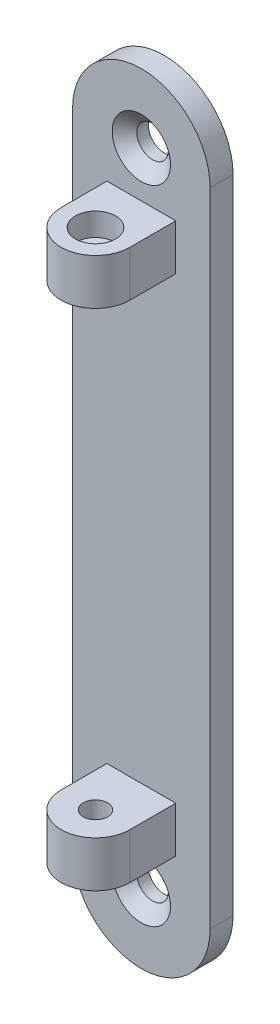
ISO-10303-21;
HEADER;
FILE_DESCRIPTION(('STEP AP214'),'2;1');
FILE_NAME('part.step','',(''),(''),'','','');
FILE_SCHEMA(('AUTOMOTIVE_DESIGN { 1 0 10303 214 1 1 1 1 }'));
ENDSEC;
DATA;
#1=APPLICATION_CONTEXT('core data for automotive mechanical design processes');
#2=APPLICATION_PROTOCOL_DEFINITION('international standard','automotive_design',2000,#1);
#3=PRODUCT_CONTEXT('',#1,'mechanical');
#4=PRODUCT('Part','Part','',(#3));
#5=PRODUCT_RELATED_PRODUCT_CATEGORY('part','',(#4));
#6=PRODUCT_DEFINITION_FORMATION('','',#4);
#7=PRODUCT_DEFINITION_CONTEXT('part definition',#1,'design');
#8=PRODUCT_DEFINITION('design','',#6,#7);
#9=PRODUCT_DEFINITION_SHAPE('','',#8);
#10=(LENGTH_UNIT() NAMED_UNIT(*) SI_UNIT(.MILLI.,.METRE.));
#11=(NAMED_UNIT(*) PLANE_ANGLE_UNIT() SI_UNIT($,.RADIAN.));
#12=(NAMED_UNIT(*) SI_UNIT($,.STERADIAN.) SOLID_ANGLE_UNIT());
#13=UNCERTAINTY_MEASURE_WITH_UNIT(LENGTH_MEASURE(1.E-05),#10,'distance_accuracy_value','');
#14=(GEOMETRIC_REPRESENTATION_CONTEXT(3) GLOBAL_UNCERTAINTY_ASSIGNED_CONTEXT((#13)) GLOBAL_UNIT_ASSIGNED_CONTEXT((#10,
#11,#12)) REPRESENTATION_CONTEXT('',''));
#15=CARTESIAN_POINT('',(0.,0.,0.));
#16=DIRECTION('',(0.,0.,1.));
#17=DIRECTION('',(1.,0.,0.));
#18=AXIS2_PLACEMENT_3D('',#15,#16,#17);
#19=CARTESIAN_POINT('',(19.05,88.9,6.35));
#20=DIRECTION('',(0.,0.,-1.));
#21=DIRECTION('',(-1.,0.,0.));
#22=AXIS2_PLACEMENT_3D('',#19,#20,#21);
#23=PLANE('',#22);
#24=DIRECTION('',(0.,-1.,0.));
#25=VECTOR('',#24,1.);
#26=CARTESIAN_POINT('',(0.,0.,6.35));
#27=LINE('',#26,#25);
#28=CARTESIAN_POINT('',(0.,88.9,6.35));
#29=VERTEX_POINT('',#28);
#30=CARTESIAN_POINT('',(0.,-88.9,6.35));
#31=VERTEX_POINT('',#30);
#32=EDGE_CURVE('E275',#29,#31,#27,.T.);
#33=ORIENTED_EDGE('',*,*,#32,.T.);
#34=CARTESIAN_POINT('',(19.05,-88.9,6.35));
#35=DIRECTION('',(0.,0.,-1.));
#36=DIRECTION('',(-1.,0.,0.));
#37=AXIS2_PLACEMENT_3D('',#34,#35,#36);
#38=CIRCLE('',#37,19.05);
#39=CARTESIAN_POINT('',(38.1,-88.9,6.35));
#40=VERTEX_POINT('',#39);
#41=EDGE_CURVE('E181',#40,#31,#38,.T.);
#42=ORIENTED_EDGE('',*,*,#41,.F.);
#43=DIRECTION('',(0.,1.,0.));
#44=VECTOR('',#43,1.);
#45=CARTESIAN_POINT('',(38.1,88.9,6.35));
#46=LINE('',#45,#44);
#47=CARTESIAN_POINT('',(38.1,88.9,6.35));
#48=VERTEX_POINT('',#47);
#49=EDGE_CURVE('E268',#40,#48,#46,.T.);
#50=ORIENTED_EDGE('',*,*,#49,.T.);
#51=CARTESIAN_POINT('',(19.05,88.9,6.35));
#52=DIRECTION('',(0.,0.,1.));
#53=DIRECTION('',(-1.,0.,0.));
#54=AXIS2_PLACEMENT_3D('',#51,#52,#53);
#55=CIRCLE('',#54,19.05);
#56=EDGE_CURVE('E271',#48,#29,#55,.T.);
#57=ORIENTED_EDGE('',*,*,#56,.T.);
#58=EDGE_LOOP('',(#33,#42,#50,#57));
#59=FACE_BOUND('',#58,.T.);
#60=CARTESIAN_POINT('',(19.05,88.9,6.35));
#61=DIRECTION('',(0.,0.,1.));
#62=DIRECTION('',(1.,0.,0.));
#63=AXIS2_PLACEMENT_3D('',#60,#61,#62);
#64=CIRCLE('',#63,8.0645);
#65=CARTESIAN_POINT('',(27.1145,88.9,6.35));
#66=VERTEX_POINT('',#65);
#67=EDGE_CURVE('E255',#66,#66,#64,.T.);
#68=ORIENTED_EDGE('',*,*,#67,.F.);
#69=EDGE_LOOP('',(#68));
#70=FACE_BOUND('',#69,.T.);
#71=DIRECTION('',(0.,1.,0.));
#72=VECTOR('',#71,1.);
#73=CARTESIAN_POINT('',(28.575,63.5,6.35));
#74=LINE('',#73,#72);
#75=CARTESIAN_POINT('',(28.575,63.5,6.35));
#76=VERTEX_POINT('',#75);
#77=CARTESIAN_POINT('',(28.575,76.2,6.35));
#78=VERTEX_POINT('',#77);
#79=EDGE_CURVE('E217',#76,#78,#74,.T.);
#80=ORIENTED_EDGE('',*,*,#79,.F.);
#81=DIRECTION('',(1.,0.,0.));
#82=VECTOR('',#81,1.);
#83=CARTESIAN_POINT('',(9.525,63.5,6.35));
#84=LINE('',#83,#82);
#85=CARTESIAN_POINT('',(9.525,63.5,6.35));
#86=VERTEX_POINT('',#85);
#87=EDGE_CURVE('E226',#86,#76,#84,.T.);
#88=ORIENTED_EDGE('',*,*,#87,.F.);
#89=DIRECTION('',(0.,-1.,0.));
#90=VECTOR('',#89,1.);
#91=CARTESIAN_POINT('',(9.525,63.5,6.35));
#92=LINE('',#91,#90);
#93=CARTESIAN_POINT('',(9.525,76.2,6.35));
#94=VERTEX_POINT('',#93);
#95=EDGE_CURVE('E60',#94,#86,#92,.T.);
#96=ORIENTED_EDGE('',*,*,#95,.F.);
#97=DIRECTION('',(-1.,0.,0.));
#98=VECTOR('',#97,1.);
#99=CARTESIAN_POINT('',(9.525,76.2,6.35));
#100=LINE('',#99,#98);
#101=EDGE_CURVE('E55',#78,#94,#100,.T.);
#102=ORIENTED_EDGE('',*,*,#101,.F.);
#103=EDGE_LOOP('',(#80,#88,#96,#102));
#104=FACE_BOUND('',#103,.T.);
#105=CARTESIAN_POINT('',(19.05,-88.9,6.35));
#106=DIRECTION('',(0.,0.,-1.));
#107=DIRECTION('',(1.,0.,0.));
#108=AXIS2_PLACEMENT_3D('',#105,#106,#107);
#109=CIRCLE('',#108,8.0645);
#110=CARTESIAN_POINT('',(27.1145,-88.9,6.35));
#111=VERTEX_POINT('',#110);
#112=EDGE_CURVE('E168',#111,#111,#109,.T.);
#113=ORIENTED_EDGE('',*,*,#112,.T.);
#114=EDGE_LOOP('',(#113));
#115=FACE_BOUND('',#114,.T.);
#116=DIRECTION('',(0.,-1.,0.));
#117=VECTOR('',#116,1.);
#118=CARTESIAN_POINT('',(28.575,-63.5,6.35));
#119=LINE('',#118,#117);
#120=CARTESIAN_POINT('',(28.575,-63.5,6.35));
#121=VERTEX_POINT('',#120);
#122=CARTESIAN_POINT('',(28.575,-76.2,6.35));
#123=VERTEX_POINT('',#122);
#124=EDGE_CURVE('E137',#121,#123,#119,.T.);
#125=ORIENTED_EDGE('',*,*,#124,.T.);
#126=DIRECTION('',(-1.,0.,0.));
#127=VECTOR('',#126,1.);
#128=CARTESIAN_POINT('',(9.52499999999999,-76.2,6.35));
#129=LINE('',#128,#127);
#130=CARTESIAN_POINT('',(9.52499999999999,-76.2,6.35));
#131=VERTEX_POINT('',#130);
#132=EDGE_CURVE('E343',#123,#131,#129,.T.);
#133=ORIENTED_EDGE('',*,*,#132,.T.);
#134=DIRECTION('',(0.,1.,0.));
#135=VECTOR('',#134,1.);
#136=CARTESIAN_POINT('',(9.52499999999999,-63.5,6.35));
#137=LINE('',#136,#135);
#138=CARTESIAN_POINT('',(9.52499999999999,-63.5,6.35));
#139=VERTEX_POINT('',#138);
#140=EDGE_CURVE('E347',#131,#139,#137,.T.);
#141=ORIENTED_EDGE('',*,*,#140,.T.);
#142=DIRECTION('',(1.,0.,0.));
#143=VECTOR('',#142,1.);
#144=CARTESIAN_POINT('',(9.52499999999999,-63.5,6.35));
#145=LINE('',#144,#143);
#146=EDGE_CURVE('E148',#139,#121,#145,.T.);
#147=ORIENTED_EDGE('',*,*,#146,.T.);
#148=EDGE_LOOP('',(#125,#133,#141,#147));
#149=FACE_BOUND('',#148,.T.);
#150=ADVANCED_FACE('F39',(#59,#70,#104,#115,#149),#23,.F.);
#151=CARTESIAN_POINT('',(38.1,88.9,6.35));
#152=DIRECTION('',(-1.,0.,0.));
#153=DIRECTION('',(0.,-1.,0.));
#154=AXIS2_PLACEMENT_3D('',#151,#152,#153);
#155=PLANE('',#154);
#156=DIRECTION('',(0.,1.,0.));
#157=VECTOR('',#156,1.);
#158=CARTESIAN_POINT('',(38.1,88.9,0.));
#159=LINE('',#158,#157);
#160=CARTESIAN_POINT('',(38.1,-88.9,0.));
#161=VERTEX_POINT('',#160);
#162=CARTESIAN_POINT('',(38.1,88.9,0.));
#163=VERTEX_POINT('',#162);
#164=EDGE_CURVE('E267',#161,#163,#159,.T.);
#165=ORIENTED_EDGE('',*,*,#164,.T.);
#166=DIRECTION('',(0.,0.,-1.));
#167=VECTOR('',#166,1.);
#168=CARTESIAN_POINT('',(38.1,88.9,6.35));
#169=LINE('',#168,#167);
#170=EDGE_CURVE('E11',#48,#163,#169,.T.);
#171=ORIENTED_EDGE('',*,*,#170,.F.);
#172=ORIENTED_EDGE('',*,*,#49,.F.);
#173=DIRECTION('',(0.,0.,-1.));
#174=VECTOR('',#173,1.);
#175=CARTESIAN_POINT('',(38.1,-88.9,6.35));
#176=LINE('',#175,#174);
#177=EDGE_CURVE('E192',#40,#161,#176,.T.);
#178=ORIENTED_EDGE('',*,*,#177,.T.);
#179=EDGE_LOOP('',(#165,#171,#172,#178));
#180=FACE_BOUND('',#179,.T.);
#181=ADVANCED_FACE('F41',(#180),#155,.F.);
#182=CARTESIAN_POINT('',(19.05,88.9,6.35));
#183=DIRECTION('',(0.,0.,-1.));
#184=DIRECTION('',(-1.,0.,0.));
#185=AXIS2_PLACEMENT_3D('',#182,#183,#184);
#186=CYLINDRICAL_SURFACE('',#185,19.05);
#187=CARTESIAN_POINT('',(19.05,88.9,0.));
#188=DIRECTION('',(0.,0.,1.));
#189=DIRECTION('',(-1.,0.,0.));
#190=AXIS2_PLACEMENT_3D('',#187,#188,#189);
#191=CIRCLE('',#190,19.05);
#192=CARTESIAN_POINT('',(0.,88.9,0.));
#193=VERTEX_POINT('',#192);
#194=EDGE_CURVE('E280',#163,#193,#191,.T.);
#195=ORIENTED_EDGE('',*,*,#194,.T.);
#196=DIRECTION('',(0.,0.,-1.));
#197=VECTOR('',#196,1.);
#198=CARTESIAN_POINT('',(0.,88.9,6.35));
#199=LINE('',#198,#197);
#200=EDGE_CURVE('E48',#29,#193,#199,.T.);
#201=ORIENTED_EDGE('',*,*,#200,.F.);
#202=ORIENTED_EDGE('',*,*,#56,.F.);
#203=ORIENTED_EDGE('',*,*,#170,.T.);
#204=EDGE_LOOP('',(#195,#201,#202,#203));
#205=FACE_BOUND('',#204,.T.);
#206=ADVANCED_FACE('F307',(#205),#186,.T.);
#207=CARTESIAN_POINT('',(0.,0.,6.35));
#208=DIRECTION('',(1.,0.,0.));
#209=DIRECTION('',(0.,0.,-1.));
#210=AXIS2_PLACEMENT_3D('',#207,#208,#209);
#211=PLANE('',#210);
#212=DIRECTION('',(0.,-1.,0.));
#213=VECTOR('',#212,1.);
#214=CARTESIAN_POINT('',(0.,0.,0.));
#215=LINE('',#214,#213);
#216=CARTESIAN_POINT('',(0.,-88.9,0.));
#217=VERTEX_POINT('',#216);
#218=EDGE_CURVE('E272',#193,#217,#215,.T.);
#219=ORIENTED_EDGE('',*,*,#218,.T.);
#220=DIRECTION('',(0.,0.,-1.));
#221=VECTOR('',#220,1.);
#222=CARTESIAN_POINT('',(0.,-88.9,6.35));
#223=LINE('',#222,#221);
#224=EDGE_CURVE('E185',#31,#217,#223,.T.);
#225=ORIENTED_EDGE('',*,*,#224,.F.);
#226=ORIENTED_EDGE('',*,*,#32,.F.);
#227=ORIENTED_EDGE('',*,*,#200,.T.);
#228=EDGE_LOOP('',(#219,#225,#226,#227));
#229=FACE_BOUND('',#228,.T.);
#230=ADVANCED_FACE('F290',(#229),#211,.F.);
#231=CARTESIAN_POINT('',(19.05,88.9,0.));
#232=DIRECTION('',(0.,0.,-1.));
#233=DIRECTION('',(-1.,0.,0.));
#234=AXIS2_PLACEMENT_3D('',#231,#232,#233);
#235=PLANE('',#234);
#236=CARTESIAN_POINT('',(19.05,88.9,0.));
#237=DIRECTION('',(0.,0.,1.));
#238=DIRECTION('',(1.,0.,0.));
#239=AXIS2_PLACEMENT_3D('',#236,#237,#238);
#240=CIRCLE('',#239,4.36499);
#241=CARTESIAN_POINT('',(23.41499,88.9,0.));
#242=VERTEX_POINT('',#241);
#243=EDGE_CURVE('E263',#242,#242,#240,.T.);
#244=ORIENTED_EDGE('',*,*,#243,.T.);
#245=EDGE_LOOP('',(#244));
#246=FACE_BOUND('',#245,.T.);
#247=ORIENTED_EDGE('',*,*,#164,.F.);
#248=CARTESIAN_POINT('',(19.05,-88.9,0.));
#249=DIRECTION('',(0.,0.,-1.));
#250=DIRECTION('',(-1.,0.,0.));
#251=AXIS2_PLACEMENT_3D('',#248,#249,#250);
#252=CIRCLE('',#251,19.05);
#253=EDGE_CURVE('E180',#161,#217,#252,.T.);
#254=ORIENTED_EDGE('',*,*,#253,.T.);
#255=ORIENTED_EDGE('',*,*,#218,.F.);
#256=ORIENTED_EDGE('',*,*,#194,.F.);
#257=EDGE_LOOP('',(#247,#254,#255,#256));
#258=FACE_BOUND('',#257,.T.);
#259=CARTESIAN_POINT('',(19.05,-88.9,0.));
#260=DIRECTION('',(0.,0.,-1.));
#261=DIRECTION('',(1.,0.,0.));
#262=AXIS2_PLACEMENT_3D('',#259,#260,#261);
#263=CIRCLE('',#262,4.36499);
#264=CARTESIAN_POINT('',(23.41499,-88.9,0.));
#265=VERTEX_POINT('',#264);
#266=EDGE_CURVE('E176',#265,#265,#263,.T.);
#267=ORIENTED_EDGE('',*,*,#266,.F.);
#268=EDGE_LOOP('',(#267));
#269=FACE_BOUND('',#268,.T.);
#270=ADVANCED_FACE('F296',(#246,#258,#269),#235,.T.);
#271=CARTESIAN_POINT('',(19.05,88.9,6.35));
#272=DIRECTION('',(0.,0.,1.));
#273=DIRECTION('',(1.,0.,0.));
#274=AXIS2_PLACEMENT_3D('',#271,#272,#273);
#275=CYLINDRICAL_SURFACE('',#274,4.36499);
#276=ORIENTED_EDGE('',*,*,#243,.F.);
#277=EDGE_LOOP('',(#276));
#278=FACE_BOUND('',#277,.T.);
#279=CARTESIAN_POINT('',(19.05,88.9,3.24574252346335));
#280=DIRECTION('',(0.,0.,1.));
#281=DIRECTION('',(1.,0.,0.));
#282=AXIS2_PLACEMENT_3D('',#279,#280,#281);
#283=CIRCLE('',#282,4.36499);
#284=CARTESIAN_POINT('',(23.41499,88.9,3.24574252346335));
#285=VERTEX_POINT('',#284);
#286=EDGE_CURVE('E259',#285,#285,#283,.T.);
#287=ORIENTED_EDGE('',*,*,#286,.T.);
#288=EDGE_LOOP('',(#287));
#289=FACE_BOUND('',#288,.T.);
#290=ADVANCED_FACE('F320',(#278,#289),#275,.F.);
#291=CARTESIAN_POINT('',(19.05,88.9,6.35));
#292=DIRECTION('',(0.,0.,1.));
#293=DIRECTION('',(1.,0.,0.));
#294=AXIS2_PLACEMENT_3D('',#291,#292,#293);
#295=CONICAL_SURFACE('',#294,8.0645,0.872664625997166);
#296=ORIENTED_EDGE('',*,*,#286,.F.);
#297=EDGE_LOOP('',(#296));
#298=FACE_BOUND('',#297,.T.);
#299=ORIENTED_EDGE('',*,*,#67,.T.);
#300=EDGE_LOOP('',(#299));
#301=FACE_BOUND('',#300,.T.);
#302=ADVANCED_FACE('F327',(#298,#301),#295,.F.);
#303=CARTESIAN_POINT('',(28.575,63.5,19.05));
#304=DIRECTION('',(-1.,0.,0.));
#305=DIRECTION('',(0.,0.,1.));
#306=AXIS2_PLACEMENT_3D('',#303,#304,#305);
#307=PLANE('',#306);
#308=ORIENTED_EDGE('',*,*,#79,.T.);
#309=DIRECTION('',(0.,0.,-1.));
#310=VECTOR('',#309,1.);
#311=CARTESIAN_POINT('',(28.575,76.2,19.05));
#312=LINE('',#311,#310);
#313=CARTESIAN_POINT('',(28.575,76.2,19.05));
#314=VERTEX_POINT('',#313);
#315=EDGE_CURVE('E252',#314,#78,#312,.T.);
#316=ORIENTED_EDGE('',*,*,#315,.F.);
#317=DIRECTION('',(0.,1.,0.));
#318=VECTOR('',#317,1.);
#319=CARTESIAN_POINT('',(28.575,63.5,19.05));
#320=LINE('',#319,#318);
#321=CARTESIAN_POINT('',(28.575,63.5,19.05));
#322=VERTEX_POINT('',#321);
#323=EDGE_CURVE('E221',#322,#314,#320,.T.);
#324=ORIENTED_EDGE('',*,*,#323,.F.);
#325=DIRECTION('',(0.,0.,-1.));
#326=VECTOR('',#325,1.);
#327=CARTESIAN_POINT('',(28.575,63.5,19.05));
#328=LINE('',#327,#326);
#329=EDGE_CURVE('E230',#322,#76,#328,.T.);
#330=ORIENTED_EDGE('',*,*,#329,.T.);
#331=EDGE_LOOP('',(#308,#316,#324,#330));
#332=FACE_BOUND('',#331,.T.);
#333=ADVANCED_FACE('F335',(#332),#307,.F.);
#334=CARTESIAN_POINT('',(9.525,76.2,19.05));
#335=DIRECTION('',(0.,-1.,0.));
#336=DIRECTION('',(0.,0.,-1.));
#337=AXIS2_PLACEMENT_3D('',#334,#335,#336);
#338=PLANE('',#337);
#339=CARTESIAN_POINT('',(19.05,76.2,19.05));
#340=DIRECTION('',(0.,1.,0.));
#341=DIRECTION('',(0.,0.,1.));
#342=AXIS2_PLACEMENT_3D('',#339,#340,#341);
#343=CIRCLE('',#342,5.55625);
#344=CARTESIAN_POINT('',(19.05,76.2,24.60625));
#345=VERTEX_POINT('',#344);
#346=EDGE_CURVE('E196',#345,#345,#343,.T.);
#347=ORIENTED_EDGE('',*,*,#346,.F.);
#348=EDGE_LOOP('',(#347));
#349=FACE_BOUND('',#348,.T.);
#350=ORIENTED_EDGE('',*,*,#101,.T.);
#351=DIRECTION('',(0.,0.,-1.));
#352=VECTOR('',#351,1.);
#353=CARTESIAN_POINT('',(9.525,76.2,19.05));
#354=LINE('',#353,#352);
#355=CARTESIAN_POINT('',(9.525,76.2,19.05));
#356=VERTEX_POINT('',#355);
#357=EDGE_CURVE('E248',#356,#94,#354,.T.);
#358=ORIENTED_EDGE('',*,*,#357,.F.);
#359=CARTESIAN_POINT('',(19.05,76.2,19.05));
#360=DIRECTION('',(0.,1.,0.));
#361=DIRECTION('',(0.,0.,1.));
#362=AXIS2_PLACEMENT_3D('',#359,#360,#361);
#363=CIRCLE('',#362,9.525);
#364=EDGE_CURVE('E201',#356,#314,#363,.T.);
#365=ORIENTED_EDGE('',*,*,#364,.T.);
#366=ORIENTED_EDGE('',*,*,#315,.T.);
#367=EDGE_LOOP('',(#350,#358,#365,#366));
#368=FACE_BOUND('',#367,.T.);
#369=ADVANCED_FACE('F437',(#349,#368),#338,.F.);
#370=CARTESIAN_POINT('',(9.525,63.5,19.05));
#371=DIRECTION('',(1.,0.,0.));
#372=DIRECTION('',(0.,0.,-1.));
#373=AXIS2_PLACEMENT_3D('',#370,#371,#372);
#374=PLANE('',#373);
#375=ORIENTED_EDGE('',*,*,#95,.T.);
#376=DIRECTION('',(0.,0.,-1.));
#377=VECTOR('',#376,1.);
#378=CARTESIAN_POINT('',(9.525,63.5,19.05));
#379=LINE('',#378,#377);
#380=CARTESIAN_POINT('',(9.525,63.5,19.05));
#381=VERTEX_POINT('',#380);
#382=EDGE_CURVE('E244',#381,#86,#379,.T.);
#383=ORIENTED_EDGE('',*,*,#382,.F.);
#384=DIRECTION('',(0.,-1.,0.));
#385=VECTOR('',#384,1.);
#386=CARTESIAN_POINT('',(9.525,63.5,19.05));
#387=LINE('',#386,#385);
#388=EDGE_CURVE('E225',#356,#381,#387,.T.);
#389=ORIENTED_EDGE('',*,*,#388,.F.);
#390=ORIENTED_EDGE('',*,*,#357,.T.);
#391=EDGE_LOOP('',(#375,#383,#389,#390));
#392=FACE_BOUND('',#391,.T.);
#393=ADVANCED_FACE('F433',(#392),#374,.F.);
#394=CARTESIAN_POINT('',(9.525,63.5,19.05));
#395=DIRECTION('',(0.,1.,0.));
#396=DIRECTION('',(0.,0.,1.));
#397=AXIS2_PLACEMENT_3D('',#394,#395,#396);
#398=PLANE('',#397);
#399=CARTESIAN_POINT('',(19.05,63.5,19.05));
#400=DIRECTION('',(0.,1.,0.));
#401=DIRECTION('',(0.,0.,1.));
#402=AXIS2_PLACEMENT_3D('',#399,#400,#401);
#403=CIRCLE('',#402,3.3782);
#404=CARTESIAN_POINT('',(19.05,63.5,22.4282));
#405=VERTEX_POINT('',#404);
#406=EDGE_CURVE('E197',#405,#405,#403,.F.);
#407=ORIENTED_EDGE('',*,*,#406,.F.);
#408=EDGE_LOOP('',(#407));
#409=FACE_BOUND('',#408,.T.);
#410=ORIENTED_EDGE('',*,*,#87,.T.);
#411=ORIENTED_EDGE('',*,*,#329,.F.);
#412=CARTESIAN_POINT('',(19.05,63.5,19.05));
#413=DIRECTION('',(0.,1.,0.));
#414=DIRECTION('',(0.,0.,1.));
#415=AXIS2_PLACEMENT_3D('',#412,#413,#414);
#416=CIRCLE('',#415,9.525);
#417=EDGE_CURVE('E213',#322,#381,#416,.F.);
#418=ORIENTED_EDGE('',*,*,#417,.T.);
#419=ORIENTED_EDGE('',*,*,#382,.T.);
#420=EDGE_LOOP('',(#410,#411,#418,#419));
#421=FACE_BOUND('',#420,.T.);
#422=ADVANCED_FACE('F429',(#409,#421),#398,.F.);
#423=CARTESIAN_POINT('',(19.05,42.2014525143145,19.05));
#424=DIRECTION('',(0.,1.,0.));
#425=DIRECTION('',(0.,0.,1.));
#426=AXIS2_PLACEMENT_3D('',#423,#424,#425);
#427=CYLINDRICAL_SURFACE('',#426,9.525);
#428=ORIENTED_EDGE('',*,*,#417,.F.);
#429=ORIENTED_EDGE('',*,*,#323,.T.);
#430=ORIENTED_EDGE('',*,*,#364,.F.);
#431=ORIENTED_EDGE('',*,*,#388,.T.);
#432=EDGE_LOOP('',(#428,#429,#430,#431));
#433=FACE_BOUND('',#432,.T.);
#434=ADVANCED_FACE('F425',(#433),#427,.T.);
#435=CARTESIAN_POINT('',(19.05,76.2,19.05));
#436=DIRECTION('',(0.,1.,0.));
#437=DIRECTION('',(0.,0.,1.));
#438=AXIS2_PLACEMENT_3D('',#435,#436,#437);
#439=CYLINDRICAL_SURFACE('',#438,3.3782);
#440=ORIENTED_EDGE('',*,*,#406,.T.);
#441=EDGE_LOOP('',(#440));
#442=FACE_BOUND('',#441,.T.);
#443=CARTESIAN_POINT('',(19.05,69.85,19.05));
#444=DIRECTION('',(0.,1.,0.));
#445=DIRECTION('',(0.,0.,1.));
#446=AXIS2_PLACEMENT_3D('',#443,#444,#445);
#447=CIRCLE('',#446,3.3782);
#448=CARTESIAN_POINT('',(19.05,69.85,22.4282));
#449=VERTEX_POINT('',#448);
#450=EDGE_CURVE('E202',#449,#449,#447,.T.);
#451=ORIENTED_EDGE('',*,*,#450,.T.);
#452=EDGE_LOOP('',(#451));
#453=FACE_BOUND('',#452,.T.);
#454=ADVANCED_FACE('F421',(#442,#453),#439,.F.);
#455=CARTESIAN_POINT('',(22.4282,69.85,19.05));
#456=DIRECTION('',(0.,-1.,0.));
#457=DIRECTION('',(0.,0.,-1.));
#458=AXIS2_PLACEMENT_3D('',#455,#456,#457);
#459=PLANE('',#458);
#460=ORIENTED_EDGE('',*,*,#450,.F.);
#461=EDGE_LOOP('',(#460));
#462=FACE_BOUND('',#461,.T.);
#463=CARTESIAN_POINT('',(19.05,69.85,19.05));
#464=DIRECTION('',(0.,1.,0.));
#465=DIRECTION('',(0.,0.,1.));
#466=AXIS2_PLACEMENT_3D('',#463,#464,#465);
#467=CIRCLE('',#466,5.55625);
#468=CARTESIAN_POINT('',(19.05,69.85,24.60625));
#469=VERTEX_POINT('',#468);
#470=EDGE_CURVE('E206',#469,#469,#467,.T.);
#471=ORIENTED_EDGE('',*,*,#470,.T.);
#472=EDGE_LOOP('',(#471));
#473=FACE_BOUND('',#472,.T.);
#474=ADVANCED_FACE('F417',(#462,#473),#459,.F.);
#475=CARTESIAN_POINT('',(19.05,76.2,19.05));
#476=DIRECTION('',(0.,1.,0.));
#477=DIRECTION('',(0.,0.,1.));
#478=AXIS2_PLACEMENT_3D('',#475,#476,#477);
#479=CYLINDRICAL_SURFACE('',#478,5.55625);
#480=ORIENTED_EDGE('',*,*,#470,.F.);
#481=EDGE_LOOP('',(#480));
#482=FACE_BOUND('',#481,.T.);
#483=ORIENTED_EDGE('',*,*,#346,.T.);
#484=EDGE_LOOP('',(#483));
#485=FACE_BOUND('',#484,.T.);
#486=ADVANCED_FACE('F414',(#482,#485),#479,.F.);
#487=CARTESIAN_POINT('',(19.05,-88.9,6.35));
#488=DIRECTION('',(0.,0.,-1.));
#489=DIRECTION('',(-1.,0.,0.));
#490=AXIS2_PLACEMENT_3D('',#487,#488,#489);
#491=CYLINDRICAL_SURFACE('',#490,19.05);
#492=ORIENTED_EDGE('',*,*,#253,.F.);
#493=ORIENTED_EDGE('',*,*,#177,.F.);
#494=ORIENTED_EDGE('',*,*,#41,.T.);
#495=ORIENTED_EDGE('',*,*,#224,.T.);
#496=EDGE_LOOP('',(#492,#493,#494,#495));
#497=FACE_BOUND('',#496,.T.);
#498=ADVANCED_FACE('F301',(#497),#491,.T.);
#499=CARTESIAN_POINT('',(19.05,-88.9,6.35));
#500=DIRECTION('',(0.,0.,1.));
#501=DIRECTION('',(1.,0.,0.));
#502=AXIS2_PLACEMENT_3D('',#499,#500,#501);
#503=CYLINDRICAL_SURFACE('',#502,4.36499);
#504=ORIENTED_EDGE('',*,*,#266,.T.);
#505=EDGE_LOOP('',(#504));
#506=FACE_BOUND('',#505,.T.);
#507=CARTESIAN_POINT('',(19.05,-88.9,3.24574252346335));
#508=DIRECTION('',(0.,0.,-1.));
#509=DIRECTION('',(1.,0.,0.));
#510=AXIS2_PLACEMENT_3D('',#507,#508,#509);
#511=CIRCLE('',#510,4.36499);
#512=CARTESIAN_POINT('',(23.41499,-88.9,3.24574252346335));
#513=VERTEX_POINT('',#512);
#514=EDGE_CURVE('E172',#513,#513,#511,.T.);
#515=ORIENTED_EDGE('',*,*,#514,.F.);
#516=EDGE_LOOP('',(#515));
#517=FACE_BOUND('',#516,.T.);
#518=ADVANCED_FACE('F407',(#506,#517),#503,.F.);
#519=CARTESIAN_POINT('',(19.05,-88.9,6.35));
#520=DIRECTION('',(0.,0.,1.));
#521=DIRECTION('',(1.,0.,0.));
#522=AXIS2_PLACEMENT_3D('',#519,#520,#521);
#523=CONICAL_SURFACE('',#522,8.0645,0.872664625997166);
#524=ORIENTED_EDGE('',*,*,#514,.T.);
#525=EDGE_LOOP('',(#524));
#526=FACE_BOUND('',#525,.T.);
#527=ORIENTED_EDGE('',*,*,#112,.F.);
#528=EDGE_LOOP('',(#527));
#529=FACE_BOUND('',#528,.T.);
#530=ADVANCED_FACE('F404',(#526,#529),#523,.F.);
#531=CARTESIAN_POINT('',(28.575,-63.5,19.05));
#532=DIRECTION('',(-1.,0.,0.));
#533=DIRECTION('',(0.,0.,1.));
#534=AXIS2_PLACEMENT_3D('',#531,#532,#533);
#535=PLANE('',#534);
#536=ORIENTED_EDGE('',*,*,#124,.F.);
#537=DIRECTION('',(0.,0.,-1.));
#538=VECTOR('',#537,1.);
#539=CARTESIAN_POINT('',(28.575,-63.5,19.05));
#540=LINE('',#539,#538);
#541=CARTESIAN_POINT('',(28.575,-63.5,19.05));
#542=VERTEX_POINT('',#541);
#543=EDGE_CURVE('E131',#542,#121,#540,.T.);
#544=ORIENTED_EDGE('',*,*,#543,.F.);
#545=DIRECTION('',(0.,-1.,0.));
#546=VECTOR('',#545,1.);
#547=CARTESIAN_POINT('',(28.575,-63.5,19.05));
#548=LINE('',#547,#546);
#549=CARTESIAN_POINT('',(28.575,-76.2,19.05));
#550=VERTEX_POINT('',#549);
#551=EDGE_CURVE('E141',#542,#550,#548,.T.);
#552=ORIENTED_EDGE('',*,*,#551,.T.);
#553=DIRECTION('',(0.,0.,-1.));
#554=VECTOR('',#553,1.);
#555=CARTESIAN_POINT('',(28.575,-76.2,19.05));
#556=LINE('',#555,#554);
#557=EDGE_CURVE('E165',#550,#123,#556,.T.);
#558=ORIENTED_EDGE('',*,*,#557,.T.);
#559=EDGE_LOOP('',(#536,#544,#552,#558));
#560=FACE_BOUND('',#559,.T.);
#561=ADVANCED_FACE('F151',(#560),#535,.F.);
#562=CARTESIAN_POINT('',(9.52499999999999,-76.2,19.05));
#563=DIRECTION('',(0.,1.,0.));
#564=DIRECTION('',(0.,0.,-1.));
#565=AXIS2_PLACEMENT_3D('',#562,#563,#564);
#566=PLANE('',#565);
#567=CARTESIAN_POINT('',(19.05,-76.2,19.05));
#568=DIRECTION('',(0.,1.,0.));
#569=DIRECTION('',(0.,0.,1.));
#570=AXIS2_PLACEMENT_3D('',#567,#568,#569);
#571=CIRCLE('',#570,5.55625);
#572=CARTESIAN_POINT('',(19.05,-76.2,24.60625));
#573=VERTEX_POINT('',#572);
#574=EDGE_CURVE('E372',#573,#573,#571,.T.);
#575=ORIENTED_EDGE('',*,*,#574,.T.);
#576=EDGE_LOOP('',(#575));
#577=FACE_BOUND('',#576,.T.);
#578=ORIENTED_EDGE('',*,*,#132,.F.);
#579=ORIENTED_EDGE('',*,*,#557,.F.);
#580=CARTESIAN_POINT('',(19.05,-76.2,19.05));
#581=DIRECTION('',(0.,1.,0.));
#582=DIRECTION('',(0.,0.,1.));
#583=AXIS2_PLACEMENT_3D('',#580,#581,#582);
#584=CIRCLE('',#583,9.525);
#585=CARTESIAN_POINT('',(9.52499999999999,-76.2,19.05));
#586=VERTEX_POINT('',#585);
#587=EDGE_CURVE('E138',#586,#550,#584,.T.);
#588=ORIENTED_EDGE('',*,*,#587,.F.);
#589=DIRECTION('',(0.,0.,-1.));
#590=VECTOR('',#589,1.);
#591=CARTESIAN_POINT('',(9.52499999999999,-76.2,19.05));
#592=LINE('',#591,#590);
#593=EDGE_CURVE('E157',#586,#131,#592,.T.);
#594=ORIENTED_EDGE('',*,*,#593,.T.);
#595=EDGE_LOOP('',(#578,#579,#588,#594));
#596=FACE_BOUND('',#595,.T.);
#597=ADVANCED_FACE('F356',(#577,#596),#566,.F.);
#598=CARTESIAN_POINT('',(9.52499999999999,-63.5,19.05));
#599=DIRECTION('',(1.,0.,0.));
#600=DIRECTION('',(0.,0.,-1.));
#601=AXIS2_PLACEMENT_3D('',#598,#599,#600);
#602=PLANE('',#601);
#603=ORIENTED_EDGE('',*,*,#140,.F.);
#604=ORIENTED_EDGE('',*,*,#593,.F.);
#605=DIRECTION('',(0.,1.,0.));
#606=VECTOR('',#605,1.);
#607=CARTESIAN_POINT('',(9.52499999999999,-63.5,19.05));
#608=LINE('',#607,#606);
#609=CARTESIAN_POINT('',(9.52499999999999,-63.5,19.05));
#610=VERTEX_POINT('',#609);
#611=EDGE_CURVE('E147',#586,#610,#608,.T.);
#612=ORIENTED_EDGE('',*,*,#611,.T.);
#613=DIRECTION('',(0.,0.,-1.));
#614=VECTOR('',#613,1.);
#615=CARTESIAN_POINT('',(9.52499999999999,-63.5,19.05));
#616=LINE('',#615,#614);
#617=EDGE_CURVE('E133',#610,#139,#616,.T.);
#618=ORIENTED_EDGE('',*,*,#617,.T.);
#619=EDGE_LOOP('',(#603,#604,#612,#618));
#620=FACE_BOUND('',#619,.T.);
#621=ADVANCED_FACE('F354',(#620),#602,.F.);
#622=CARTESIAN_POINT('',(9.52499999999999,-63.5,19.05));
#623=DIRECTION('',(0.,-1.,0.));
#624=DIRECTION('',(0.,0.,1.));
#625=AXIS2_PLACEMENT_3D('',#622,#623,#624);
#626=PLANE('',#625);
#627=CARTESIAN_POINT('',(19.05,-63.5,19.05));
#628=DIRECTION('',(0.,1.,0.));
#629=DIRECTION('',(0.,0.,1.));
#630=AXIS2_PLACEMENT_3D('',#627,#628,#629);
#631=CIRCLE('',#630,3.3782);
#632=CARTESIAN_POINT('',(19.05,-63.5,22.4282));
#633=VERTEX_POINT('',#632);
#634=EDGE_CURVE('E358',#633,#633,#631,.F.);
#635=ORIENTED_EDGE('',*,*,#634,.T.);
#636=EDGE_LOOP('',(#635));
#637=FACE_BOUND('',#636,.T.);
#638=ORIENTED_EDGE('',*,*,#146,.F.);
#639=ORIENTED_EDGE('',*,*,#617,.F.);
#640=CARTESIAN_POINT('',(19.05,-63.5,19.05));
#641=DIRECTION('',(0.,1.,0.));
#642=DIRECTION('',(0.,0.,1.));
#643=AXIS2_PLACEMENT_3D('',#640,#641,#642);
#644=CIRCLE('',#643,9.525);
#645=EDGE_CURVE('E126',#542,#610,#644,.F.);
#646=ORIENTED_EDGE('',*,*,#645,.F.);
#647=ORIENTED_EDGE('',*,*,#543,.T.);
#648=EDGE_LOOP('',(#638,#639,#646,#647));
#649=FACE_BOUND('',#648,.T.);
#650=ADVANCED_FACE('F129',(#637,#649),#626,.F.);
#651=CARTESIAN_POINT('',(19.05,-42.2014525143145,19.05));
#652=DIRECTION('',(0.,-1.,0.));
#653=DIRECTION('',(0.,0.,1.));
#654=AXIS2_PLACEMENT_3D('',#651,#652,#653);
#655=CYLINDRICAL_SURFACE('',#654,9.525);
#656=ORIENTED_EDGE('',*,*,#645,.T.);
#657=ORIENTED_EDGE('',*,*,#611,.F.);
#658=ORIENTED_EDGE('',*,*,#587,.T.);
#659=ORIENTED_EDGE('',*,*,#551,.F.);
#660=EDGE_LOOP('',(#656,#657,#658,#659));
#661=FACE_BOUND('',#660,.T.);
#662=ADVANCED_FACE('F142',(#661),#655,.T.);
#663=CARTESIAN_POINT('',(19.05,-76.2,19.05));
#664=DIRECTION('',(0.,-1.,0.));
#665=DIRECTION('',(0.,0.,1.));
#666=AXIS2_PLACEMENT_3D('',#663,#664,#665);
#667=CYLINDRICAL_SURFACE('',#666,3.3782);
#668=ORIENTED_EDGE('',*,*,#634,.F.);
#669=EDGE_LOOP('',(#668));
#670=FACE_BOUND('',#669,.T.);
#671=CARTESIAN_POINT('',(19.05,-69.85,19.05));
#672=DIRECTION('',(0.,1.,0.));
#673=DIRECTION('',(0.,0.,1.));
#674=AXIS2_PLACEMENT_3D('',#671,#672,#673);
#675=CIRCLE('',#674,3.3782);
#676=CARTESIAN_POINT('',(19.05,-69.85,22.4282));
#677=VERTEX_POINT('',#676);
#678=EDGE_CURVE('E362',#677,#677,#675,.T.);
#679=ORIENTED_EDGE('',*,*,#678,.F.);
#680=EDGE_LOOP('',(#679));
#681=FACE_BOUND('',#680,.T.);
#682=ADVANCED_FACE('F386',(#670,#681),#667,.F.);
#683=CARTESIAN_POINT('',(22.4282,-69.85,19.05));
#684=DIRECTION('',(0.,1.,0.));
#685=DIRECTION('',(0.,0.,-1.));
#686=AXIS2_PLACEMENT_3D('',#683,#684,#685);
#687=PLANE('',#686);
#688=ORIENTED_EDGE('',*,*,#678,.T.);
#689=EDGE_LOOP('',(#688));
#690=FACE_BOUND('',#689,.T.);
#691=CARTESIAN_POINT('',(19.05,-69.85,19.05));
#692=DIRECTION('',(0.,1.,0.));
#693=DIRECTION('',(0.,0.,1.));
#694=AXIS2_PLACEMENT_3D('',#691,#692,#693);
#695=CIRCLE('',#694,5.55625);
#696=CARTESIAN_POINT('',(19.05,-69.85,24.60625));
#697=VERTEX_POINT('',#696);
#698=EDGE_CURVE('E368',#697,#697,#695,.T.);
#699=ORIENTED_EDGE('',*,*,#698,.F.);
#700=EDGE_LOOP('',(#699));
#701=FACE_BOUND('',#700,.T.);
#702=ADVANCED_FACE('F380',(#690,#701),#687,.F.);
#703=CARTESIAN_POINT('',(19.05,-76.2,19.05));
#704=DIRECTION('',(0.,-1.,0.));
#705=DIRECTION('',(0.,0.,1.));
#706=AXIS2_PLACEMENT_3D('',#703,#704,#705);
#707=CYLINDRICAL_SURFACE('',#706,5.55625);
#708=ORIENTED_EDGE('',*,*,#698,.T.);
#709=EDGE_LOOP('',(#708));
#710=FACE_BOUND('',#709,.T.);
#711=ORIENTED_EDGE('',*,*,#574,.F.);
#712=EDGE_LOOP('',(#711));
#713=FACE_BOUND('',#712,.T.);
#714=ADVANCED_FACE('F378',(#710,#713),#707,.F.);
#715=CLOSED_SHELL('',(#150,#181,#206,#230,#270,#290,#302,#333,#369,#393,#422,#434,#454,#474,
#486,#498,#518,#530,#561,#597,#621,#650,#662,#682,#702,#714));
#716=MANIFOLD_SOLID_BREP('B2',#715);
#717=ADVANCED_BREP_SHAPE_REPRESENTATION('',(#18,#716),#14);
#718=SHAPE_DEFINITION_REPRESENTATION(#9,#717);
ENDSEC;
END-ISO-10303-21;
